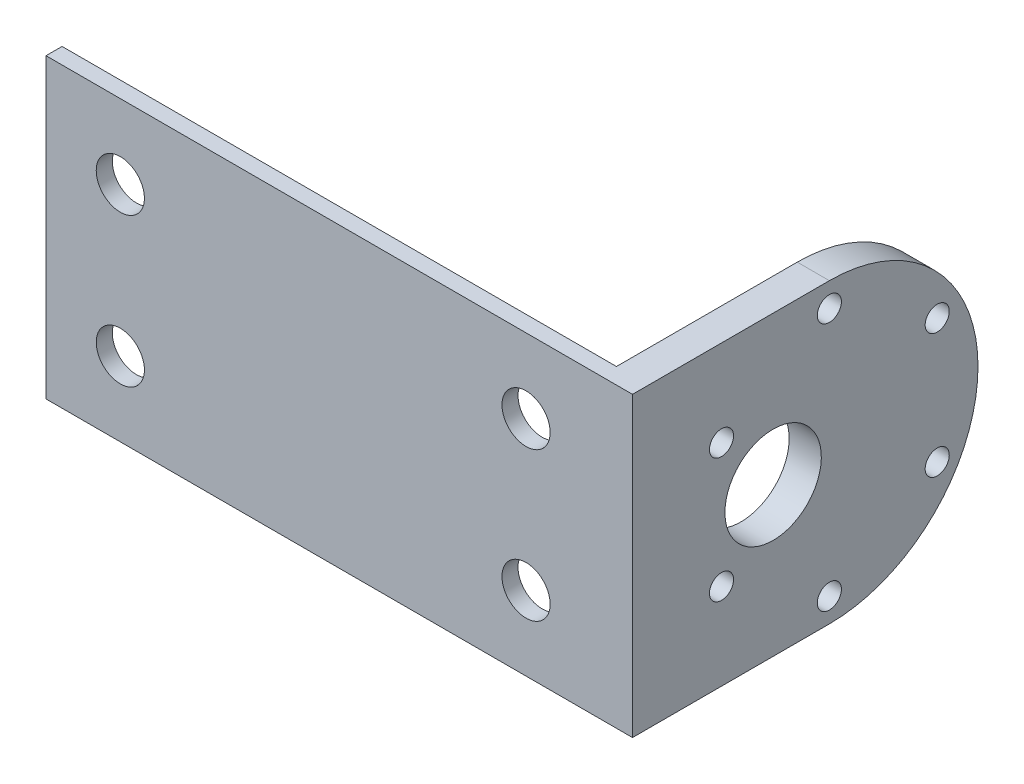
ISO-10303-21;
HEADER;
FILE_DESCRIPTION(('STEP AP214'),'2;1');
FILE_NAME('part.step','',(''),(''),'','','');
FILE_SCHEMA(('AUTOMOTIVE_DESIGN { 1 0 10303 214 1 1 1 1 }'));
ENDSEC;
DATA;
#1=APPLICATION_CONTEXT('core data for automotive mechanical design processes');
#2=APPLICATION_PROTOCOL_DEFINITION('international standard','automotive_design',2000,#1);
#3=PRODUCT_CONTEXT('',#1,'mechanical');
#4=PRODUCT('Part','Part','',(#3));
#5=PRODUCT_RELATED_PRODUCT_CATEGORY('part','',(#4));
#6=PRODUCT_DEFINITION_FORMATION('','',#4);
#7=PRODUCT_DEFINITION_CONTEXT('part definition',#1,'design');
#8=PRODUCT_DEFINITION('design','',#6,#7);
#9=PRODUCT_DEFINITION_SHAPE('','',#8);
#10=(LENGTH_UNIT() NAMED_UNIT(*) SI_UNIT(.MILLI.,.METRE.));
#11=(NAMED_UNIT(*) PLANE_ANGLE_UNIT() SI_UNIT($,.RADIAN.));
#12=(NAMED_UNIT(*) SI_UNIT($,.STERADIAN.) SOLID_ANGLE_UNIT());
#13=UNCERTAINTY_MEASURE_WITH_UNIT(LENGTH_MEASURE(1.E-05),#10,'distance_accuracy_value','');
#14=(GEOMETRIC_REPRESENTATION_CONTEXT(3) GLOBAL_UNCERTAINTY_ASSIGNED_CONTEXT((#13)) GLOBAL_UNIT_ASSIGNED_CONTEXT((#10,
#11,#12)) REPRESENTATION_CONTEXT('',''));
#15=CARTESIAN_POINT('',(0.,0.,0.));
#16=DIRECTION('',(0.,0.,1.));
#17=DIRECTION('',(1.,0.,0.));
#18=AXIS2_PLACEMENT_3D('',#15,#16,#17);
#19=CARTESIAN_POINT('',(0.,0.,2.));
#20=DIRECTION('',(0.,0.,1.));
#21=DIRECTION('',(1.,0.,0.));
#22=AXIS2_PLACEMENT_3D('',#19,#20,#21);
#23=PLANE('',#22);
#24=CARTESIAN_POINT('',(-25.25,9.25,2.));
#25=DIRECTION('',(0.,0.,1.));
#26=DIRECTION('',(-1.,0.,0.));
#27=AXIS2_PLACEMENT_3D('',#24,#25,#26);
#28=CIRCLE('',#27,3.);
#29=CARTESIAN_POINT('',(-28.25,9.25,2.));
#30=VERTEX_POINT('',#29);
#31=EDGE_CURVE('E162',#30,#30,#28,.T.);
#32=ORIENTED_EDGE('',*,*,#31,.F.);
#33=EDGE_LOOP('',(#32));
#34=FACE_BOUND('',#33,.T.);
#35=CARTESIAN_POINT('',(25.25,9.25,2.));
#36=DIRECTION('',(0.,0.,1.));
#37=DIRECTION('',(1.,0.,0.));
#38=AXIS2_PLACEMENT_3D('',#35,#36,#37);
#39=CIRCLE('',#38,3.);
#40=CARTESIAN_POINT('',(28.25,9.25,2.));
#41=VERTEX_POINT('',#40);
#42=EDGE_CURVE('E100',#41,#41,#39,.T.);
#43=ORIENTED_EDGE('',*,*,#42,.F.);
#44=EDGE_LOOP('',(#43));
#45=FACE_BOUND('',#44,.T.);
#46=DIRECTION('',(1.,0.,0.));
#47=VECTOR('',#46,1.);
#48=CARTESIAN_POINT('',(-34.5,-18.5,2.));
#49=LINE('',#48,#47);
#50=CARTESIAN_POINT('',(-34.5,-18.5,2.));
#51=VERTEX_POINT('',#50);
#52=CARTESIAN_POINT('',(38.5,-18.5,2.));
#53=VERTEX_POINT('',#52);
#54=EDGE_CURVE('E188',#51,#53,#49,.T.);
#55=ORIENTED_EDGE('',*,*,#54,.T.);
#56=DIRECTION('',(0.,1.,0.));
#57=VECTOR('',#56,1.);
#58=CARTESIAN_POINT('',(38.5,0.,2.));
#59=LINE('',#58,#57);
#60=CARTESIAN_POINT('',(38.5,18.5,2.));
#61=VERTEX_POINT('',#60);
#62=EDGE_CURVE('E220',#53,#61,#59,.T.);
#63=ORIENTED_EDGE('',*,*,#62,.T.);
#64=DIRECTION('',(-1.,0.,0.));
#65=VECTOR('',#64,1.);
#66=CARTESIAN_POINT('',(-34.5,18.5,2.));
#67=LINE('',#66,#65);
#68=CARTESIAN_POINT('',(-34.5,18.5,2.));
#69=VERTEX_POINT('',#68);
#70=EDGE_CURVE('E88',#61,#69,#67,.T.);
#71=ORIENTED_EDGE('',*,*,#70,.T.);
#72=DIRECTION('',(0.,-1.,0.));
#73=VECTOR('',#72,1.);
#74=CARTESIAN_POINT('',(-34.5,18.5,2.));
#75=LINE('',#74,#73);
#76=EDGE_CURVE('E59',#69,#51,#75,.T.);
#77=ORIENTED_EDGE('',*,*,#76,.T.);
#78=EDGE_LOOP('',(#55,#63,#71,#77));
#79=FACE_BOUND('',#78,.T.);
#80=CARTESIAN_POINT('',(25.25,-9.24999999999999,2.));
#81=DIRECTION('',(0.,0.,1.));
#82=DIRECTION('',(-1.,0.,0.));
#83=AXIS2_PLACEMENT_3D('',#80,#81,#82);
#84=CIRCLE('',#83,3.);
#85=CARTESIAN_POINT('',(22.25,-9.24999999999999,2.));
#86=VERTEX_POINT('',#85);
#87=EDGE_CURVE('E170',#86,#86,#84,.T.);
#88=ORIENTED_EDGE('',*,*,#87,.F.);
#89=EDGE_LOOP('',(#88));
#90=FACE_BOUND('',#89,.T.);
#91=CARTESIAN_POINT('',(-25.25,-9.24999999999999,2.));
#92=DIRECTION('',(0.,0.,1.));
#93=DIRECTION('',(1.,0.,0.));
#94=AXIS2_PLACEMENT_3D('',#91,#92,#93);
#95=CIRCLE('',#94,3.);
#96=CARTESIAN_POINT('',(-22.25,-9.24999999999999,2.));
#97=VERTEX_POINT('',#96);
#98=EDGE_CURVE('E154',#97,#97,#95,.T.);
#99=ORIENTED_EDGE('',*,*,#98,.F.);
#100=EDGE_LOOP('',(#99));
#101=FACE_BOUND('',#100,.T.);
#102=ADVANCED_FACE('F41',(#34,#45,#79,#90,#101),#23,.T.);
#103=CARTESIAN_POINT('',(0.,0.,0.));
#104=DIRECTION('',(0.,0.,1.));
#105=DIRECTION('',(1.,0.,0.));
#106=AXIS2_PLACEMENT_3D('',#103,#104,#105);
#107=PLANE('',#106);
#108=DIRECTION('',(0.,1.,0.));
#109=VECTOR('',#108,1.);
#110=CARTESIAN_POINT('',(34.5,18.5,0.));
#111=LINE('',#110,#109);
#112=CARTESIAN_POINT('',(34.5,-18.5,0.));
#113=VERTEX_POINT('',#112);
#114=CARTESIAN_POINT('',(34.5,18.5,0.));
#115=VERTEX_POINT('',#114);
#116=EDGE_CURVE('E92',#113,#115,#111,.T.);
#117=ORIENTED_EDGE('',*,*,#116,.F.);
#118=DIRECTION('',(1.,0.,0.));
#119=VECTOR('',#118,1.);
#120=CARTESIAN_POINT('',(-34.5,-18.5,0.));
#121=LINE('',#120,#119);
#122=CARTESIAN_POINT('',(-34.5,-18.5,0.));
#123=VERTEX_POINT('',#122);
#124=EDGE_CURVE('E77',#123,#113,#121,.T.);
#125=ORIENTED_EDGE('',*,*,#124,.F.);
#126=DIRECTION('',(0.,-1.,0.));
#127=VECTOR('',#126,1.);
#128=CARTESIAN_POINT('',(-34.5,18.5,0.));
#129=LINE('',#128,#127);
#130=CARTESIAN_POINT('',(-34.5,18.5,0.));
#131=VERTEX_POINT('',#130);
#132=EDGE_CURVE('E71',#131,#123,#129,.T.);
#133=ORIENTED_EDGE('',*,*,#132,.F.);
#134=DIRECTION('',(-1.,0.,0.));
#135=VECTOR('',#134,1.);
#136=CARTESIAN_POINT('',(-34.5,18.5,0.));
#137=LINE('',#136,#135);
#138=EDGE_CURVE('E95',#115,#131,#137,.T.);
#139=ORIENTED_EDGE('',*,*,#138,.F.);
#140=EDGE_LOOP('',(#117,#125,#133,#139));
#141=FACE_BOUND('',#140,.T.);
#142=CARTESIAN_POINT('',(25.25,9.25,0.));
#143=DIRECTION('',(0.,0.,1.));
#144=DIRECTION('',(1.,0.,0.));
#145=AXIS2_PLACEMENT_3D('',#142,#143,#144);
#146=CIRCLE('',#145,3.);
#147=CARTESIAN_POINT('',(28.25,9.25,0.));
#148=VERTEX_POINT('',#147);
#149=EDGE_CURVE('E174',#148,#148,#146,.T.);
#150=ORIENTED_EDGE('',*,*,#149,.T.);
#151=EDGE_LOOP('',(#150));
#152=FACE_BOUND('',#151,.T.);
#153=CARTESIAN_POINT('',(25.25,-9.24999999999999,0.));
#154=DIRECTION('',(0.,0.,1.));
#155=DIRECTION('',(-1.,0.,0.));
#156=AXIS2_PLACEMENT_3D('',#153,#154,#155);
#157=CIRCLE('',#156,3.);
#158=CARTESIAN_POINT('',(22.25,-9.24999999999999,0.));
#159=VERTEX_POINT('',#158);
#160=EDGE_CURVE('E166',#159,#159,#157,.T.);
#161=ORIENTED_EDGE('',*,*,#160,.T.);
#162=EDGE_LOOP('',(#161));
#163=FACE_BOUND('',#162,.T.);
#164=CARTESIAN_POINT('',(-25.25,9.25,0.));
#165=DIRECTION('',(0.,0.,1.));
#166=DIRECTION('',(-1.,0.,0.));
#167=AXIS2_PLACEMENT_3D('',#164,#165,#166);
#168=CIRCLE('',#167,3.);
#169=CARTESIAN_POINT('',(-28.25,9.25,0.));
#170=VERTEX_POINT('',#169);
#171=EDGE_CURVE('E158',#170,#170,#168,.T.);
#172=ORIENTED_EDGE('',*,*,#171,.T.);
#173=EDGE_LOOP('',(#172));
#174=FACE_BOUND('',#173,.T.);
#175=CARTESIAN_POINT('',(-25.25,-9.24999999999999,0.));
#176=DIRECTION('',(0.,0.,1.));
#177=DIRECTION('',(1.,0.,0.));
#178=AXIS2_PLACEMENT_3D('',#175,#176,#177);
#179=CIRCLE('',#178,3.);
#180=CARTESIAN_POINT('',(-22.25,-9.24999999999999,0.));
#181=VERTEX_POINT('',#180);
#182=EDGE_CURVE('E153',#181,#181,#179,.T.);
#183=ORIENTED_EDGE('',*,*,#182,.T.);
#184=EDGE_LOOP('',(#183));
#185=FACE_BOUND('',#184,.T.);
#186=ADVANCED_FACE('F93',(#141,#152,#163,#174,#185),#107,.F.);
#187=CARTESIAN_POINT('',(-34.5,18.5,2.));
#188=DIRECTION('',(0.,-1.,0.));
#189=DIRECTION('',(0.,0.,-1.));
#190=AXIS2_PLACEMENT_3D('',#187,#188,#189);
#191=PLANE('',#190);
#192=ORIENTED_EDGE('',*,*,#138,.T.);
#193=DIRECTION('',(0.,0.,-1.));
#194=VECTOR('',#193,1.);
#195=CARTESIAN_POINT('',(-34.5,18.5,2.));
#196=LINE('',#195,#194);
#197=EDGE_CURVE('E11',#69,#131,#196,.T.);
#198=ORIENTED_EDGE('',*,*,#197,.F.);
#199=ORIENTED_EDGE('',*,*,#70,.F.);
#200=DIRECTION('',(0.,0.,1.));
#201=VECTOR('',#200,1.);
#202=CARTESIAN_POINT('',(38.5,18.5,0.));
#203=LINE('',#202,#201);
#204=CARTESIAN_POINT('',(38.5,18.5,-22.5));
#205=VERTEX_POINT('',#204);
#206=EDGE_CURVE('E224',#205,#61,#203,.T.);
#207=ORIENTED_EDGE('',*,*,#206,.F.);
#208=DIRECTION('',(-1.,0.,0.));
#209=VECTOR('',#208,1.);
#210=CARTESIAN_POINT('',(38.5,18.5,-22.5));
#211=LINE('',#210,#209);
#212=CARTESIAN_POINT('',(34.5,18.5,-22.5));
#213=VERTEX_POINT('',#212);
#214=EDGE_CURVE('E146',#205,#213,#211,.T.);
#215=ORIENTED_EDGE('',*,*,#214,.T.);
#216=DIRECTION('',(0.,0.,1.));
#217=VECTOR('',#216,1.);
#218=CARTESIAN_POINT('',(34.5,18.5,0.));
#219=LINE('',#218,#217);
#220=EDGE_CURVE('E109',#213,#115,#219,.T.);
#221=ORIENTED_EDGE('',*,*,#220,.T.);
#222=EDGE_LOOP('',(#192,#198,#199,#207,#215,#221));
#223=FACE_BOUND('',#222,.T.);
#224=ADVANCED_FACE('F43',(#223),#191,.F.);
#225=CARTESIAN_POINT('',(-34.5,18.5,2.));
#226=DIRECTION('',(1.,0.,0.));
#227=DIRECTION('',(0.,0.,-1.));
#228=AXIS2_PLACEMENT_3D('',#225,#226,#227);
#229=PLANE('',#228);
#230=ORIENTED_EDGE('',*,*,#132,.T.);
#231=DIRECTION('',(0.,0.,-1.));
#232=VECTOR('',#231,1.);
#233=CARTESIAN_POINT('',(-34.5,-18.5,2.));
#234=LINE('',#233,#232);
#235=EDGE_CURVE('E51',#51,#123,#234,.T.);
#236=ORIENTED_EDGE('',*,*,#235,.F.);
#237=ORIENTED_EDGE('',*,*,#76,.F.);
#238=ORIENTED_EDGE('',*,*,#197,.T.);
#239=EDGE_LOOP('',(#230,#236,#237,#238));
#240=FACE_BOUND('',#239,.T.);
#241=ADVANCED_FACE('F279',(#240),#229,.F.);
#242=CARTESIAN_POINT('',(-34.5,-18.5,2.));
#243=DIRECTION('',(0.,1.,0.));
#244=DIRECTION('',(0.,0.,1.));
#245=AXIS2_PLACEMENT_3D('',#242,#243,#244);
#246=PLANE('',#245);
#247=ORIENTED_EDGE('',*,*,#124,.T.);
#248=DIRECTION('',(0.,0.,-1.));
#249=VECTOR('',#248,1.);
#250=CARTESIAN_POINT('',(34.5,-18.5,0.));
#251=LINE('',#250,#249);
#252=CARTESIAN_POINT('',(34.5,-18.5,-22.5));
#253=VERTEX_POINT('',#252);
#254=EDGE_CURVE('E83',#113,#253,#251,.T.);
#255=ORIENTED_EDGE('',*,*,#254,.T.);
#256=DIRECTION('',(-1.,0.,0.));
#257=VECTOR('',#256,1.);
#258=CARTESIAN_POINT('',(38.5,-18.5,-22.5));
#259=LINE('',#258,#257);
#260=CARTESIAN_POINT('',(38.5,-18.5,-22.5));
#261=VERTEX_POINT('',#260);
#262=EDGE_CURVE('E150',#261,#253,#259,.T.);
#263=ORIENTED_EDGE('',*,*,#262,.F.);
#264=DIRECTION('',(0.,0.,-1.));
#265=VECTOR('',#264,1.);
#266=CARTESIAN_POINT('',(38.5,-18.5,0.));
#267=LINE('',#266,#265);
#268=EDGE_CURVE('E145',#53,#261,#267,.T.);
#269=ORIENTED_EDGE('',*,*,#268,.F.);
#270=ORIENTED_EDGE('',*,*,#54,.F.);
#271=ORIENTED_EDGE('',*,*,#235,.T.);
#272=EDGE_LOOP('',(#247,#255,#263,#269,#270,#271));
#273=FACE_BOUND('',#272,.T.);
#274=ADVANCED_FACE('F79',(#273),#246,.F.);
#275=CARTESIAN_POINT('',(25.25,9.25,2.));
#276=DIRECTION('',(0.,0.,-1.));
#277=DIRECTION('',(-1.,0.,0.));
#278=AXIS2_PLACEMENT_3D('',#275,#276,#277);
#279=CYLINDRICAL_SURFACE('',#278,3.);
#280=ORIENTED_EDGE('',*,*,#42,.T.);
#281=EDGE_LOOP('',(#280));
#282=FACE_BOUND('',#281,.T.);
#283=ORIENTED_EDGE('',*,*,#149,.F.);
#284=EDGE_LOOP('',(#283));
#285=FACE_BOUND('',#284,.T.);
#286=ADVANCED_FACE('F283',(#282,#285),#279,.F.);
#287=CARTESIAN_POINT('',(25.25,-9.24999999999999,2.));
#288=DIRECTION('',(0.,0.,-1.));
#289=DIRECTION('',(-1.,0.,0.));
#290=AXIS2_PLACEMENT_3D('',#287,#288,#289);
#291=CYLINDRICAL_SURFACE('',#290,3.);
#292=ORIENTED_EDGE('',*,*,#87,.T.);
#293=EDGE_LOOP('',(#292));
#294=FACE_BOUND('',#293,.T.);
#295=ORIENTED_EDGE('',*,*,#160,.F.);
#296=EDGE_LOOP('',(#295));
#297=FACE_BOUND('',#296,.T.);
#298=ADVANCED_FACE('F300',(#294,#297),#291,.F.);
#299=CARTESIAN_POINT('',(-25.25,9.25,2.));
#300=DIRECTION('',(0.,0.,-1.));
#301=DIRECTION('',(-1.,0.,0.));
#302=AXIS2_PLACEMENT_3D('',#299,#300,#301);
#303=CYLINDRICAL_SURFACE('',#302,3.);
#304=ORIENTED_EDGE('',*,*,#31,.T.);
#305=EDGE_LOOP('',(#304));
#306=FACE_BOUND('',#305,.T.);
#307=ORIENTED_EDGE('',*,*,#171,.F.);
#308=EDGE_LOOP('',(#307));
#309=FACE_BOUND('',#308,.T.);
#310=ADVANCED_FACE('F270',(#306,#309),#303,.F.);
#311=CARTESIAN_POINT('',(-25.25,-9.24999999999999,2.));
#312=DIRECTION('',(0.,0.,-1.));
#313=DIRECTION('',(-1.,0.,0.));
#314=AXIS2_PLACEMENT_3D('',#311,#312,#313);
#315=CYLINDRICAL_SURFACE('',#314,3.);
#316=ORIENTED_EDGE('',*,*,#98,.T.);
#317=EDGE_LOOP('',(#316));
#318=FACE_BOUND('',#317,.T.);
#319=ORIENTED_EDGE('',*,*,#182,.F.);
#320=EDGE_LOOP('',(#319));
#321=FACE_BOUND('',#320,.T.);
#322=ADVANCED_FACE('F267',(#318,#321),#315,.F.);
#323=CARTESIAN_POINT('',(34.5,0.,0.));
#324=DIRECTION('',(1.,0.,0.));
#325=DIRECTION('',(0.,1.,0.));
#326=AXIS2_PLACEMENT_3D('',#323,#324,#325);
#327=PLANE('',#326);
#328=CARTESIAN_POINT('',(34.5,-15.5,-22.5));
#329=DIRECTION('',(1.,0.,0.));
#330=DIRECTION('',(0.,1.,0.));
#331=AXIS2_PLACEMENT_3D('',#328,#329,#330);
#332=CIRCLE('',#331,1.5);
#333=CARTESIAN_POINT('',(34.5,-14.,-22.5));
#334=VERTEX_POINT('',#333);
#335=EDGE_CURVE('E117',#334,#334,#332,.T.);
#336=ORIENTED_EDGE('',*,*,#335,.T.);
#337=EDGE_LOOP('',(#336));
#338=FACE_BOUND('',#337,.T.);
#339=CARTESIAN_POINT('',(34.5,-7.74999999999996,-9.07660624134129));
#340=DIRECTION('',(1.,0.,0.));
#341=DIRECTION('',(0.,1.,0.));
#342=AXIS2_PLACEMENT_3D('',#339,#340,#341);
#343=CIRCLE('',#342,1.5);
#344=CARTESIAN_POINT('',(34.5,-6.24999999999997,-9.07660624134129));
#345=VERTEX_POINT('',#344);
#346=EDGE_CURVE('E121',#345,#345,#343,.T.);
#347=ORIENTED_EDGE('',*,*,#346,.T.);
#348=EDGE_LOOP('',(#347));
#349=FACE_BOUND('',#348,.T.);
#350=CARTESIAN_POINT('',(34.5,7.75,-9.07660624134137));
#351=DIRECTION('',(1.,0.,0.));
#352=DIRECTION('',(0.,1.,0.));
#353=AXIS2_PLACEMENT_3D('',#350,#351,#352);
#354=CIRCLE('',#353,1.5);
#355=CARTESIAN_POINT('',(34.5,9.25,-9.07660624134137));
#356=VERTEX_POINT('',#355);
#357=EDGE_CURVE('E125',#356,#356,#354,.T.);
#358=ORIENTED_EDGE('',*,*,#357,.T.);
#359=EDGE_LOOP('',(#358));
#360=FACE_BOUND('',#359,.T.);
#361=CARTESIAN_POINT('',(34.5,15.4999999999999,-22.5000000000002));
#362=DIRECTION('',(1.,0.,0.));
#363=DIRECTION('',(0.,1.,0.));
#364=AXIS2_PLACEMENT_3D('',#361,#362,#363);
#365=CIRCLE('',#364,1.5);
#366=CARTESIAN_POINT('',(34.5,16.9999999999999,-22.5000000000002));
#367=VERTEX_POINT('',#366);
#368=EDGE_CURVE('E129',#367,#367,#365,.T.);
#369=ORIENTED_EDGE('',*,*,#368,.T.);
#370=EDGE_LOOP('',(#369));
#371=FACE_BOUND('',#370,.T.);
#372=CARTESIAN_POINT('',(34.5,7.74999999999986,-35.9233937586589));
#373=DIRECTION('',(1.,0.,0.));
#374=DIRECTION('',(0.,1.,0.));
#375=AXIS2_PLACEMENT_3D('',#372,#373,#374);
#376=CIRCLE('',#375,1.50000000000001);
#377=CARTESIAN_POINT('',(34.5,9.24999999999987,-35.9233937586589));
#378=VERTEX_POINT('',#377);
#379=EDGE_CURVE('E133',#378,#378,#376,.T.);
#380=ORIENTED_EDGE('',*,*,#379,.T.);
#381=EDGE_LOOP('',(#380));
#382=FACE_BOUND('',#381,.T.);
#383=CARTESIAN_POINT('',(34.5,-7.7500000000001,-35.9233937586588));
#384=DIRECTION('',(1.,0.,0.));
#385=DIRECTION('',(0.,1.,0.));
#386=AXIS2_PLACEMENT_3D('',#383,#384,#385);
#387=CIRCLE('',#386,1.5);
#388=CARTESIAN_POINT('',(34.5,-6.25000000000009,-35.9233937586588));
#389=VERTEX_POINT('',#388);
#390=EDGE_CURVE('E137',#389,#389,#387,.T.);
#391=ORIENTED_EDGE('',*,*,#390,.T.);
#392=EDGE_LOOP('',(#391));
#393=FACE_BOUND('',#392,.T.);
#394=CARTESIAN_POINT('',(34.5,0.,-15.5));
#395=DIRECTION('',(1.,0.,0.));
#396=DIRECTION('',(0.,1.,0.));
#397=AXIS2_PLACEMENT_3D('',#394,#395,#396);
#398=CIRCLE('',#397,6.);
#399=CARTESIAN_POINT('',(34.5,5.99999999999999,-15.5));
#400=VERTEX_POINT('',#399);
#401=EDGE_CURVE('E141',#400,#400,#398,.F.);
#402=ORIENTED_EDGE('',*,*,#401,.F.);
#403=EDGE_LOOP('',(#402));
#404=FACE_BOUND('',#403,.T.);
#405=ORIENTED_EDGE('',*,*,#254,.F.);
#406=ORIENTED_EDGE('',*,*,#116,.T.);
#407=ORIENTED_EDGE('',*,*,#220,.F.);
#408=CARTESIAN_POINT('',(34.5,0.,-22.5));
#409=DIRECTION('',(1.,0.,0.));
#410=DIRECTION('',(0.,1.,0.));
#411=AXIS2_PLACEMENT_3D('',#408,#409,#410);
#412=CIRCLE('',#411,18.5);
#413=EDGE_CURVE('E104',#253,#213,#412,.T.);
#414=ORIENTED_EDGE('',*,*,#413,.F.);
#415=EDGE_LOOP('',(#405,#406,#407,#414));
#416=FACE_BOUND('',#415,.T.);
#417=ADVANCED_FACE('F102',(#338,#349,#360,#371,#382,#393,#404,#416),#327,.F.);
#418=CARTESIAN_POINT('',(38.5,0.,-22.5));
#419=DIRECTION('',(-1.,0.,0.));
#420=DIRECTION('',(0.,-1.,0.));
#421=AXIS2_PLACEMENT_3D('',#418,#419,#420);
#422=CYLINDRICAL_SURFACE('',#421,18.5);
#423=ORIENTED_EDGE('',*,*,#413,.T.);
#424=ORIENTED_EDGE('',*,*,#214,.F.);
#425=CARTESIAN_POINT('',(38.5,0.,-22.5));
#426=DIRECTION('',(1.,0.,0.));
#427=DIRECTION('',(0.,1.,0.));
#428=AXIS2_PLACEMENT_3D('',#425,#426,#427);
#429=CIRCLE('',#428,18.5);
#430=EDGE_CURVE('E228',#261,#205,#429,.T.);
#431=ORIENTED_EDGE('',*,*,#430,.F.);
#432=ORIENTED_EDGE('',*,*,#262,.T.);
#433=EDGE_LOOP('',(#423,#424,#431,#432));
#434=FACE_BOUND('',#433,.T.);
#435=ADVANCED_FACE('F248',(#434),#422,.T.);
#436=CARTESIAN_POINT('',(38.5,-7.7500000000001,-35.9233937586588));
#437=DIRECTION('',(-1.,0.,0.));
#438=DIRECTION('',(0.,-1.,0.));
#439=AXIS2_PLACEMENT_3D('',#436,#437,#438);
#440=CYLINDRICAL_SURFACE('',#439,1.5);
#441=CARTESIAN_POINT('',(38.5,-7.7500000000001,-35.9233937586588));
#442=DIRECTION('',(1.,0.,0.));
#443=DIRECTION('',(0.,1.,0.));
#444=AXIS2_PLACEMENT_3D('',#441,#442,#443);
#445=CIRCLE('',#444,1.5);
#446=CARTESIAN_POINT('',(38.5,-6.25000000000009,-35.9233937586588));
#447=VERTEX_POINT('',#446);
#448=EDGE_CURVE('E198',#447,#447,#445,.T.);
#449=ORIENTED_EDGE('',*,*,#448,.T.);
#450=EDGE_LOOP('',(#449));
#451=FACE_BOUND('',#450,.T.);
#452=ORIENTED_EDGE('',*,*,#390,.F.);
#453=EDGE_LOOP('',(#452));
#454=FACE_BOUND('',#453,.T.);
#455=ADVANCED_FACE('F332',(#451,#454),#440,.F.);
#456=CARTESIAN_POINT('',(38.5,7.74999999999986,-35.9233937586589));
#457=DIRECTION('',(-1.,0.,0.));
#458=DIRECTION('',(0.,-1.,0.));
#459=AXIS2_PLACEMENT_3D('',#456,#457,#458);
#460=CYLINDRICAL_SURFACE('',#459,1.50000000000001);
#461=CARTESIAN_POINT('',(38.5,7.74999999999986,-35.9233937586589));
#462=DIRECTION('',(1.,0.,0.));
#463=DIRECTION('',(0.,1.,0.));
#464=AXIS2_PLACEMENT_3D('',#461,#462,#463);
#465=CIRCLE('',#464,1.50000000000001);
#466=CARTESIAN_POINT('',(38.5,9.24999999999987,-35.9233937586589));
#467=VERTEX_POINT('',#466);
#468=EDGE_CURVE('E201',#467,#467,#465,.T.);
#469=ORIENTED_EDGE('',*,*,#468,.T.);
#470=EDGE_LOOP('',(#469));
#471=FACE_BOUND('',#470,.T.);
#472=ORIENTED_EDGE('',*,*,#379,.F.);
#473=EDGE_LOOP('',(#472));
#474=FACE_BOUND('',#473,.T.);
#475=ADVANCED_FACE('F339',(#471,#474),#460,.F.);
#476=CARTESIAN_POINT('',(38.5,15.4999999999999,-22.5000000000002));
#477=DIRECTION('',(-1.,0.,0.));
#478=DIRECTION('',(0.,-1.,0.));
#479=AXIS2_PLACEMENT_3D('',#476,#477,#478);
#480=CYLINDRICAL_SURFACE('',#479,1.5);
#481=CARTESIAN_POINT('',(38.5,15.4999999999999,-22.5000000000002));
#482=DIRECTION('',(1.,0.,0.));
#483=DIRECTION('',(0.,1.,0.));
#484=AXIS2_PLACEMENT_3D('',#481,#482,#483);
#485=CIRCLE('',#484,1.5);
#486=CARTESIAN_POINT('',(38.5,16.9999999999999,-22.5000000000002));
#487=VERTEX_POINT('',#486);
#488=EDGE_CURVE('E204',#487,#487,#485,.T.);
#489=ORIENTED_EDGE('',*,*,#488,.T.);
#490=EDGE_LOOP('',(#489));
#491=FACE_BOUND('',#490,.T.);
#492=ORIENTED_EDGE('',*,*,#368,.F.);
#493=EDGE_LOOP('',(#492));
#494=FACE_BOUND('',#493,.T.);
#495=ADVANCED_FACE('F347',(#491,#494),#480,.F.);
#496=CARTESIAN_POINT('',(38.5,7.75,-9.07660624134137));
#497=DIRECTION('',(-1.,0.,0.));
#498=DIRECTION('',(0.,-1.,0.));
#499=AXIS2_PLACEMENT_3D('',#496,#497,#498);
#500=CYLINDRICAL_SURFACE('',#499,1.5);
#501=CARTESIAN_POINT('',(38.5,7.75,-9.07660624134137));
#502=DIRECTION('',(1.,0.,0.));
#503=DIRECTION('',(0.,1.,0.));
#504=AXIS2_PLACEMENT_3D('',#501,#502,#503);
#505=CIRCLE('',#504,1.5);
#506=CARTESIAN_POINT('',(38.5,9.25,-9.07660624134137));
#507=VERTEX_POINT('',#506);
#508=EDGE_CURVE('E208',#507,#507,#505,.T.);
#509=ORIENTED_EDGE('',*,*,#508,.T.);
#510=EDGE_LOOP('',(#509));
#511=FACE_BOUND('',#510,.T.);
#512=ORIENTED_EDGE('',*,*,#357,.F.);
#513=EDGE_LOOP('',(#512));
#514=FACE_BOUND('',#513,.T.);
#515=ADVANCED_FACE('F355',(#511,#514),#500,.F.);
#516=CARTESIAN_POINT('',(38.5,-7.74999999999996,-9.07660624134129));
#517=DIRECTION('',(-1.,0.,0.));
#518=DIRECTION('',(0.,-1.,0.));
#519=AXIS2_PLACEMENT_3D('',#516,#517,#518);
#520=CYLINDRICAL_SURFACE('',#519,1.5);
#521=CARTESIAN_POINT('',(38.5,-7.74999999999996,-9.07660624134129));
#522=DIRECTION('',(1.,0.,0.));
#523=DIRECTION('',(0.,1.,0.));
#524=AXIS2_PLACEMENT_3D('',#521,#522,#523);
#525=CIRCLE('',#524,1.5);
#526=CARTESIAN_POINT('',(38.5,-6.24999999999996,-9.07660624134129));
#527=VERTEX_POINT('',#526);
#528=EDGE_CURVE('E212',#527,#527,#525,.T.);
#529=ORIENTED_EDGE('',*,*,#528,.T.);
#530=EDGE_LOOP('',(#529));
#531=FACE_BOUND('',#530,.T.);
#532=ORIENTED_EDGE('',*,*,#346,.F.);
#533=EDGE_LOOP('',(#532));
#534=FACE_BOUND('',#533,.T.);
#535=ADVANCED_FACE('F363',(#531,#534),#520,.F.);
#536=CARTESIAN_POINT('',(38.5,-15.5,-22.5));
#537=DIRECTION('',(-1.,0.,0.));
#538=DIRECTION('',(0.,-1.,0.));
#539=AXIS2_PLACEMENT_3D('',#536,#537,#538);
#540=CYLINDRICAL_SURFACE('',#539,1.5);
#541=CARTESIAN_POINT('',(38.5,-15.5,-22.5));
#542=DIRECTION('',(1.,0.,0.));
#543=DIRECTION('',(0.,1.,0.));
#544=AXIS2_PLACEMENT_3D('',#541,#542,#543);
#545=CIRCLE('',#544,1.5);
#546=CARTESIAN_POINT('',(38.5,-14.,-22.5));
#547=VERTEX_POINT('',#546);
#548=EDGE_CURVE('E216',#547,#547,#545,.T.);
#549=ORIENTED_EDGE('',*,*,#548,.T.);
#550=EDGE_LOOP('',(#549));
#551=FACE_BOUND('',#550,.T.);
#552=ORIENTED_EDGE('',*,*,#335,.F.);
#553=EDGE_LOOP('',(#552));
#554=FACE_BOUND('',#553,.T.);
#555=ADVANCED_FACE('F371',(#551,#554),#540,.F.);
#556=CARTESIAN_POINT('',(38.5,0.,-15.5));
#557=DIRECTION('',(-1.,0.,0.));
#558=DIRECTION('',(0.,-1.,0.));
#559=AXIS2_PLACEMENT_3D('',#556,#557,#558);
#560=CYLINDRICAL_SURFACE('',#559,6.);
#561=CARTESIAN_POINT('',(38.5,0.,-15.5));
#562=DIRECTION('',(1.,0.,0.));
#563=DIRECTION('',(0.,1.,0.));
#564=AXIS2_PLACEMENT_3D('',#561,#562,#563);
#565=CIRCLE('',#564,6.);
#566=CARTESIAN_POINT('',(38.5,5.99999999999999,-15.5));
#567=VERTEX_POINT('',#566);
#568=EDGE_CURVE('E112',#567,#567,#565,.F.);
#569=ORIENTED_EDGE('',*,*,#568,.F.);
#570=EDGE_LOOP('',(#569));
#571=FACE_BOUND('',#570,.T.);
#572=ORIENTED_EDGE('',*,*,#401,.T.);
#573=EDGE_LOOP('',(#572));
#574=FACE_BOUND('',#573,.T.);
#575=ADVANCED_FACE('F379',(#571,#574),#560,.F.);
#576=CARTESIAN_POINT('',(38.5,0.,0.));
#577=DIRECTION('',(1.,0.,0.));
#578=DIRECTION('',(0.,1.,0.));
#579=AXIS2_PLACEMENT_3D('',#576,#577,#578);
#580=PLANE('',#579);
#581=ORIENTED_EDGE('',*,*,#268,.T.);
#582=ORIENTED_EDGE('',*,*,#430,.T.);
#583=ORIENTED_EDGE('',*,*,#206,.T.);
#584=ORIENTED_EDGE('',*,*,#62,.F.);
#585=EDGE_LOOP('',(#581,#582,#583,#584));
#586=FACE_BOUND('',#585,.T.);
#587=ORIENTED_EDGE('',*,*,#548,.F.);
#588=EDGE_LOOP('',(#587));
#589=FACE_BOUND('',#588,.T.);
#590=ORIENTED_EDGE('',*,*,#528,.F.);
#591=EDGE_LOOP('',(#590));
#592=FACE_BOUND('',#591,.T.);
#593=ORIENTED_EDGE('',*,*,#508,.F.);
#594=EDGE_LOOP('',(#593));
#595=FACE_BOUND('',#594,.T.);
#596=ORIENTED_EDGE('',*,*,#488,.F.);
#597=EDGE_LOOP('',(#596));
#598=FACE_BOUND('',#597,.T.);
#599=ORIENTED_EDGE('',*,*,#468,.F.);
#600=EDGE_LOOP('',(#599));
#601=FACE_BOUND('',#600,.T.);
#602=ORIENTED_EDGE('',*,*,#448,.F.);
#603=EDGE_LOOP('',(#602));
#604=FACE_BOUND('',#603,.T.);
#605=ORIENTED_EDGE('',*,*,#568,.T.);
#606=EDGE_LOOP('',(#605));
#607=FACE_BOUND('',#606,.T.);
#608=ADVANCED_FACE('F239',(#586,#589,#592,#595,#598,#601,#604,#607),#580,.T.);
#609=CLOSED_SHELL('',(#102,#186,#224,#241,#274,#286,#298,#310,#322,#417,#435,#455,#475,#495,
#515,#535,#555,#575,#608));
#610=MANIFOLD_SOLID_BREP('B2',#609);
#611=ADVANCED_BREP_SHAPE_REPRESENTATION('',(#18,#610),#14);
#612=SHAPE_DEFINITION_REPRESENTATION(#9,#611);
ENDSEC;
END-ISO-10303-21;
